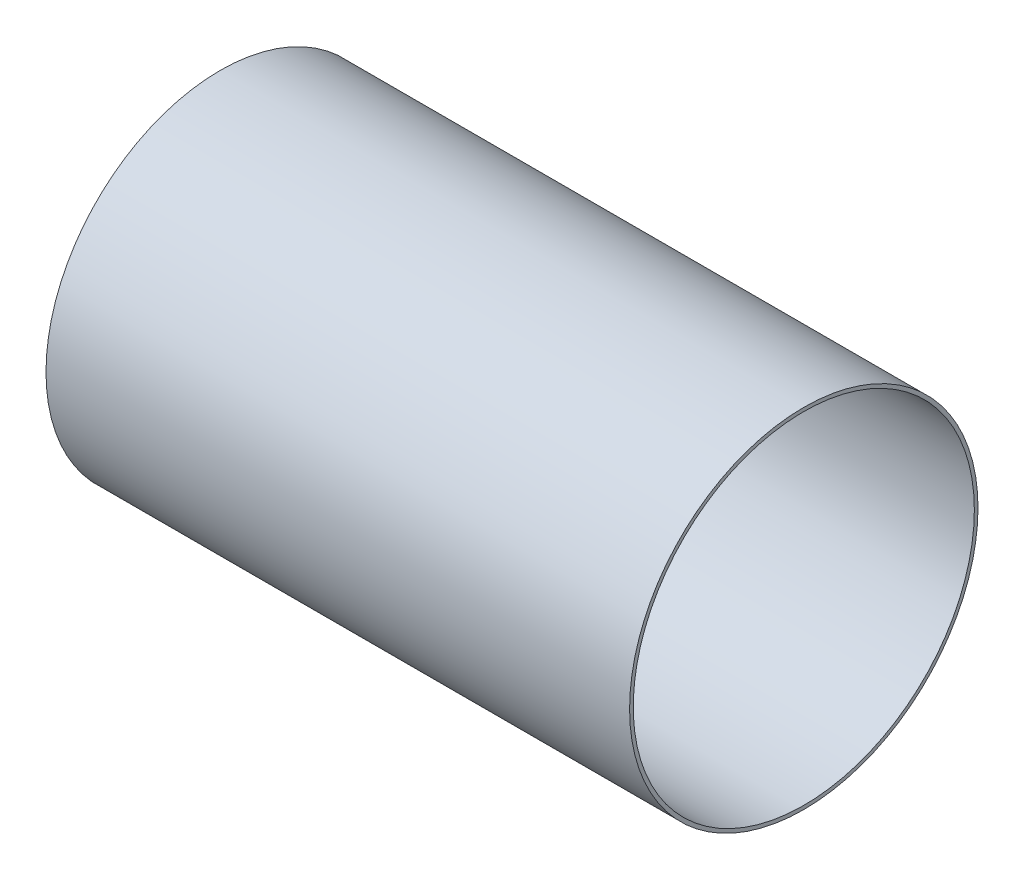
ISO-10303-21;
HEADER;
FILE_DESCRIPTION(('STEP AP214'),'2;1');
FILE_NAME('part.step','',(''),(''),'','','');
FILE_SCHEMA(('AUTOMOTIVE_DESIGN { 1 0 10303 214 1 1 1 1 }'));
ENDSEC;
DATA;
#1=APPLICATION_CONTEXT('core data for automotive mechanical design processes');
#2=APPLICATION_PROTOCOL_DEFINITION('international standard','automotive_design',2000,#1);
#3=PRODUCT_CONTEXT('',#1,'mechanical');
#4=PRODUCT('Part','Part','',(#3));
#5=PRODUCT_RELATED_PRODUCT_CATEGORY('part','',(#4));
#6=PRODUCT_DEFINITION_FORMATION('','',#4);
#7=PRODUCT_DEFINITION_CONTEXT('part definition',#1,'design');
#8=PRODUCT_DEFINITION('design','',#6,#7);
#9=PRODUCT_DEFINITION_SHAPE('','',#8);
#10=(LENGTH_UNIT() NAMED_UNIT(*) SI_UNIT(.MILLI.,.METRE.));
#11=(NAMED_UNIT(*) PLANE_ANGLE_UNIT() SI_UNIT($,.RADIAN.));
#12=(NAMED_UNIT(*) SI_UNIT($,.STERADIAN.) SOLID_ANGLE_UNIT());
#13=UNCERTAINTY_MEASURE_WITH_UNIT(LENGTH_MEASURE(1.E-05),#10,'distance_accuracy_value','');
#14=(GEOMETRIC_REPRESENTATION_CONTEXT(3) GLOBAL_UNCERTAINTY_ASSIGNED_CONTEXT((#13)) GLOBAL_UNIT_ASSIGNED_CONTEXT((#10,
#11,#12)) REPRESENTATION_CONTEXT('',''));
#15=CARTESIAN_POINT('',(0.,0.,0.));
#16=DIRECTION('',(0.,0.,1.));
#17=DIRECTION('',(1.,0.,0.));
#18=AXIS2_PLACEMENT_3D('',#15,#16,#17);
#19=CARTESIAN_POINT('',(254.,0.,0.));
#20=DIRECTION('',(1.,0.,0.));
#21=DIRECTION('',(0.,0.,-1.));
#22=AXIS2_PLACEMENT_3D('',#19,#20,#21);
#23=PLANE('',#22);
#24=CARTESIAN_POINT('',(254.,0.,0.));
#25=DIRECTION('',(1.,0.,0.));
#26=DIRECTION('',(0.,0.,-1.));
#27=AXIS2_PLACEMENT_3D('',#24,#25,#26);
#28=CIRCLE('',#27,75.819);
#29=CARTESIAN_POINT('',(254.,0.,-75.819));
#30=VERTEX_POINT('',#29);
#31=EDGE_CURVE('E10',#30,#30,#28,.T.);
#32=ORIENTED_EDGE('',*,*,#31,.T.);
#33=EDGE_LOOP('',(#32));
#34=FACE_BOUND('',#33,.T.);
#35=CARTESIAN_POINT('',(254.,0.,0.));
#36=DIRECTION('',(1.,0.,0.));
#37=DIRECTION('',(0.,0.,-1.));
#38=AXIS2_PLACEMENT_3D('',#35,#36,#37);
#39=CIRCLE('',#38,74.2315);
#40=CARTESIAN_POINT('',(254.,0.,-74.2315));
#41=VERTEX_POINT('',#40);
#42=EDGE_CURVE('E56',#41,#41,#39,.T.);
#43=ORIENTED_EDGE('',*,*,#42,.F.);
#44=EDGE_LOOP('',(#43));
#45=FACE_BOUND('',#44,.T.);
#46=ADVANCED_FACE('F43',(#34,#45),#23,.T.);
#47=CARTESIAN_POINT('',(0.,0.,0.));
#48=DIRECTION('',(1.,0.,0.));
#49=DIRECTION('',(0.,0.,-1.));
#50=AXIS2_PLACEMENT_3D('',#47,#48,#49);
#51=PLANE('',#50);
#52=CARTESIAN_POINT('',(0.,0.,0.));
#53=DIRECTION('',(1.,0.,0.));
#54=DIRECTION('',(0.,0.,-1.));
#55=AXIS2_PLACEMENT_3D('',#52,#53,#54);
#56=CIRCLE('',#55,75.819);
#57=CARTESIAN_POINT('',(0.,0.,-75.819));
#58=VERTEX_POINT('',#57);
#59=EDGE_CURVE('E47',#58,#58,#56,.T.);
#60=ORIENTED_EDGE('',*,*,#59,.F.);
#61=EDGE_LOOP('',(#60));
#62=FACE_BOUND('',#61,.T.);
#63=CARTESIAN_POINT('',(0.,0.,0.));
#64=DIRECTION('',(1.,0.,0.));
#65=DIRECTION('',(0.,0.,-1.));
#66=AXIS2_PLACEMENT_3D('',#63,#64,#65);
#67=CIRCLE('',#66,74.2315);
#68=CARTESIAN_POINT('',(0.,0.,-74.2315));
#69=VERTEX_POINT('',#68);
#70=EDGE_CURVE('E58',#69,#69,#67,.T.);
#71=ORIENTED_EDGE('',*,*,#70,.T.);
#72=EDGE_LOOP('',(#71));
#73=FACE_BOUND('',#72,.T.);
#74=ADVANCED_FACE('F70',(#62,#73),#51,.F.);
#75=CARTESIAN_POINT('',(254.,0.,0.));
#76=DIRECTION('',(-1.,0.,0.));
#77=DIRECTION('',(0.,0.,1.));
#78=AXIS2_PLACEMENT_3D('',#75,#76,#77);
#79=CYLINDRICAL_SURFACE('',#78,75.819);
#80=ORIENTED_EDGE('',*,*,#31,.F.);
#81=EDGE_LOOP('',(#80));
#82=FACE_BOUND('',#81,.T.);
#83=ORIENTED_EDGE('',*,*,#59,.T.);
#84=EDGE_LOOP('',(#83));
#85=FACE_BOUND('',#84,.T.);
#86=ADVANCED_FACE('F45',(#82,#85),#79,.T.);
#87=CARTESIAN_POINT('',(254.,0.,0.));
#88=DIRECTION('',(-1.,0.,0.));
#89=DIRECTION('',(0.,0.,1.));
#90=AXIS2_PLACEMENT_3D('',#87,#88,#89);
#91=CYLINDRICAL_SURFACE('',#90,74.2315);
#92=ORIENTED_EDGE('',*,*,#42,.T.);
#93=EDGE_LOOP('',(#92));
#94=FACE_BOUND('',#93,.T.);
#95=ORIENTED_EDGE('',*,*,#70,.F.);
#96=EDGE_LOOP('',(#95));
#97=FACE_BOUND('',#96,.T.);
#98=ADVANCED_FACE('F66',(#94,#97),#91,.F.);
#99=CLOSED_SHELL('',(#46,#74,#86,#98));
#100=MANIFOLD_SOLID_BREP('B2',#99);
#101=ADVANCED_BREP_SHAPE_REPRESENTATION('',(#18,#100),#14);
#102=SHAPE_DEFINITION_REPRESENTATION(#9,#101);
ENDSEC;
END-ISO-10303-21;
